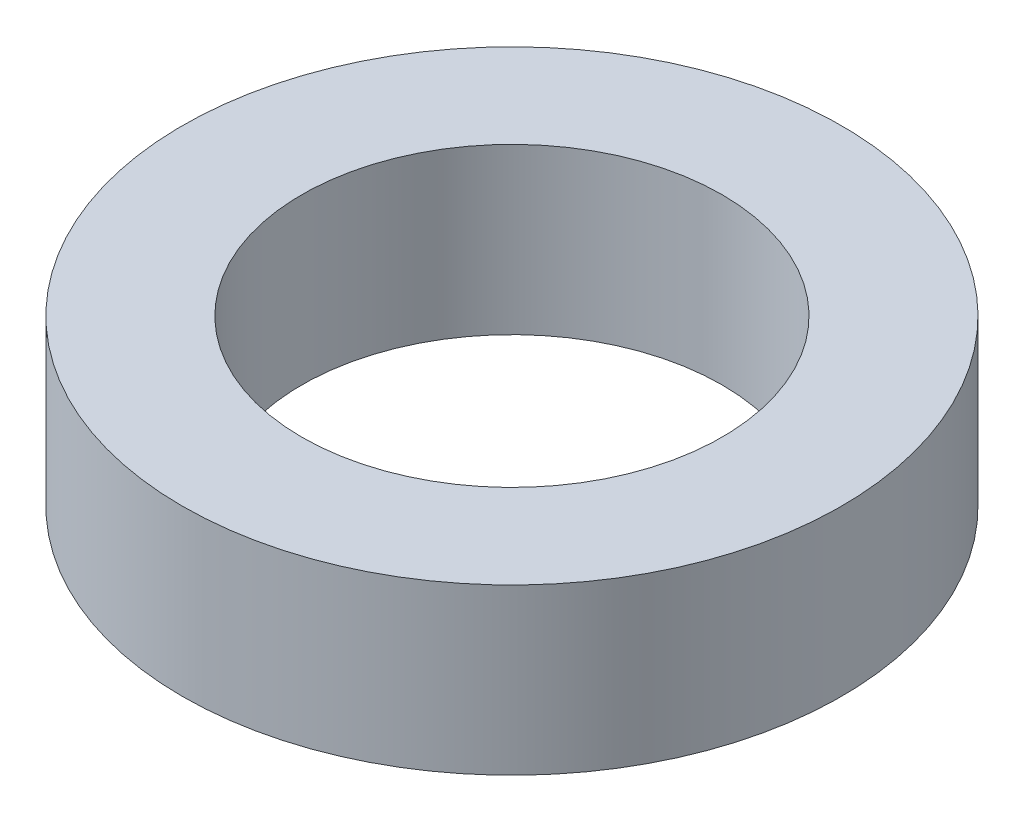
ISO-10303-21;
HEADER;
FILE_DESCRIPTION(('STEP AP214'),'2;1');
FILE_NAME('part.step','',(''),(''),'','','');
FILE_SCHEMA(('AUTOMOTIVE_DESIGN { 1 0 10303 214 1 1 1 1 }'));
ENDSEC;
DATA;
#1=APPLICATION_CONTEXT('core data for automotive mechanical design processes');
#2=APPLICATION_PROTOCOL_DEFINITION('international standard','automotive_design',2000,#1);
#3=PRODUCT_CONTEXT('',#1,'mechanical');
#4=PRODUCT('Part','Part','',(#3));
#5=PRODUCT_RELATED_PRODUCT_CATEGORY('part','',(#4));
#6=PRODUCT_DEFINITION_FORMATION('','',#4);
#7=PRODUCT_DEFINITION_CONTEXT('part definition',#1,'design');
#8=PRODUCT_DEFINITION('design','',#6,#7);
#9=PRODUCT_DEFINITION_SHAPE('','',#8);
#10=(LENGTH_UNIT() NAMED_UNIT(*) SI_UNIT(.MILLI.,.METRE.));
#11=(NAMED_UNIT(*) PLANE_ANGLE_UNIT() SI_UNIT($,.RADIAN.));
#12=(NAMED_UNIT(*) SI_UNIT($,.STERADIAN.) SOLID_ANGLE_UNIT());
#13=UNCERTAINTY_MEASURE_WITH_UNIT(LENGTH_MEASURE(1.E-05),#10,'distance_accuracy_value','');
#14=(GEOMETRIC_REPRESENTATION_CONTEXT(3) GLOBAL_UNCERTAINTY_ASSIGNED_CONTEXT((#13)) GLOBAL_UNIT_ASSIGNED_CONTEXT((#10,
#11,#12)) REPRESENTATION_CONTEXT('',''));
#15=CARTESIAN_POINT('',(0.,0.,0.));
#16=DIRECTION('',(0.,0.,1.));
#17=DIRECTION('',(1.,0.,0.));
#18=AXIS2_PLACEMENT_3D('',#15,#16,#17);
#19=CARTESIAN_POINT('',(0.,2.,0.));
#20=DIRECTION('',(0.,1.,0.));
#21=DIRECTION('',(0.,0.,1.));
#22=AXIS2_PLACEMENT_3D('',#19,#20,#21);
#23=PLANE('',#22);
#24=CARTESIAN_POINT('',(0.,2.,0.));
#25=DIRECTION('',(0.,1.,0.));
#26=DIRECTION('',(0.,0.,1.));
#27=AXIS2_PLACEMENT_3D('',#24,#25,#26);
#28=CIRCLE('',#27,4.);
#29=CARTESIAN_POINT('',(0.,2.,4.));
#30=VERTEX_POINT('',#29);
#31=EDGE_CURVE('E10',#30,#30,#28,.T.);
#32=ORIENTED_EDGE('',*,*,#31,.T.);
#33=EDGE_LOOP('',(#32));
#34=FACE_BOUND('',#33,.T.);
#35=CARTESIAN_POINT('',(0.,2.,0.));
#36=DIRECTION('',(0.,1.,0.));
#37=DIRECTION('',(0.,0.,1.));
#38=AXIS2_PLACEMENT_3D('',#35,#36,#37);
#39=CIRCLE('',#38,2.55);
#40=CARTESIAN_POINT('',(0.,2.,2.55));
#41=VERTEX_POINT('',#40);
#42=EDGE_CURVE('E42',#41,#41,#39,.T.);
#43=ORIENTED_EDGE('',*,*,#42,.F.);
#44=EDGE_LOOP('',(#43));
#45=FACE_BOUND('',#44,.T.);
#46=ADVANCED_FACE('F31',(#34,#45),#23,.T.);
#47=CARTESIAN_POINT('',(0.,0.,0.));
#48=DIRECTION('',(0.,1.,0.));
#49=DIRECTION('',(0.,0.,1.));
#50=AXIS2_PLACEMENT_3D('',#47,#48,#49);
#51=PLANE('',#50);
#52=CARTESIAN_POINT('',(0.,0.,0.));
#53=DIRECTION('',(0.,1.,0.));
#54=DIRECTION('',(0.,0.,1.));
#55=AXIS2_PLACEMENT_3D('',#52,#53,#54);
#56=CIRCLE('',#55,4.);
#57=CARTESIAN_POINT('',(0.,0.,4.));
#58=VERTEX_POINT('',#57);
#59=EDGE_CURVE('E35',#58,#58,#56,.T.);
#60=ORIENTED_EDGE('',*,*,#59,.F.);
#61=EDGE_LOOP('',(#60));
#62=FACE_BOUND('',#61,.T.);
#63=CARTESIAN_POINT('',(0.,0.,0.));
#64=DIRECTION('',(0.,1.,0.));
#65=DIRECTION('',(0.,0.,1.));
#66=AXIS2_PLACEMENT_3D('',#63,#64,#65);
#67=CIRCLE('',#66,2.55);
#68=CARTESIAN_POINT('',(0.,0.,2.55));
#69=VERTEX_POINT('',#68);
#70=EDGE_CURVE('E44',#69,#69,#67,.T.);
#71=ORIENTED_EDGE('',*,*,#70,.T.);
#72=EDGE_LOOP('',(#71));
#73=FACE_BOUND('',#72,.T.);
#74=ADVANCED_FACE('F54',(#62,#73),#51,.F.);
#75=CARTESIAN_POINT('',(0.,2.,0.));
#76=DIRECTION('',(0.,-1.,0.));
#77=DIRECTION('',(0.,0.,-1.));
#78=AXIS2_PLACEMENT_3D('',#75,#76,#77);
#79=CYLINDRICAL_SURFACE('',#78,4.);
#80=ORIENTED_EDGE('',*,*,#31,.F.);
#81=EDGE_LOOP('',(#80));
#82=FACE_BOUND('',#81,.T.);
#83=ORIENTED_EDGE('',*,*,#59,.T.);
#84=EDGE_LOOP('',(#83));
#85=FACE_BOUND('',#84,.T.);
#86=ADVANCED_FACE('F33',(#82,#85),#79,.T.);
#87=CARTESIAN_POINT('',(0.,2.,0.));
#88=DIRECTION('',(0.,-1.,0.));
#89=DIRECTION('',(0.,0.,-1.));
#90=AXIS2_PLACEMENT_3D('',#87,#88,#89);
#91=CYLINDRICAL_SURFACE('',#90,2.55);
#92=ORIENTED_EDGE('',*,*,#42,.T.);
#93=EDGE_LOOP('',(#92));
#94=FACE_BOUND('',#93,.T.);
#95=ORIENTED_EDGE('',*,*,#70,.F.);
#96=EDGE_LOOP('',(#95));
#97=FACE_BOUND('',#96,.T.);
#98=ADVANCED_FACE('F50',(#94,#97),#91,.F.);
#99=CLOSED_SHELL('',(#46,#74,#86,#98));
#100=MANIFOLD_SOLID_BREP('B2',#99);
#101=ADVANCED_BREP_SHAPE_REPRESENTATION('',(#18,#100),#14);
#102=SHAPE_DEFINITION_REPRESENTATION(#9,#101);
ENDSEC;
END-ISO-10303-21;
